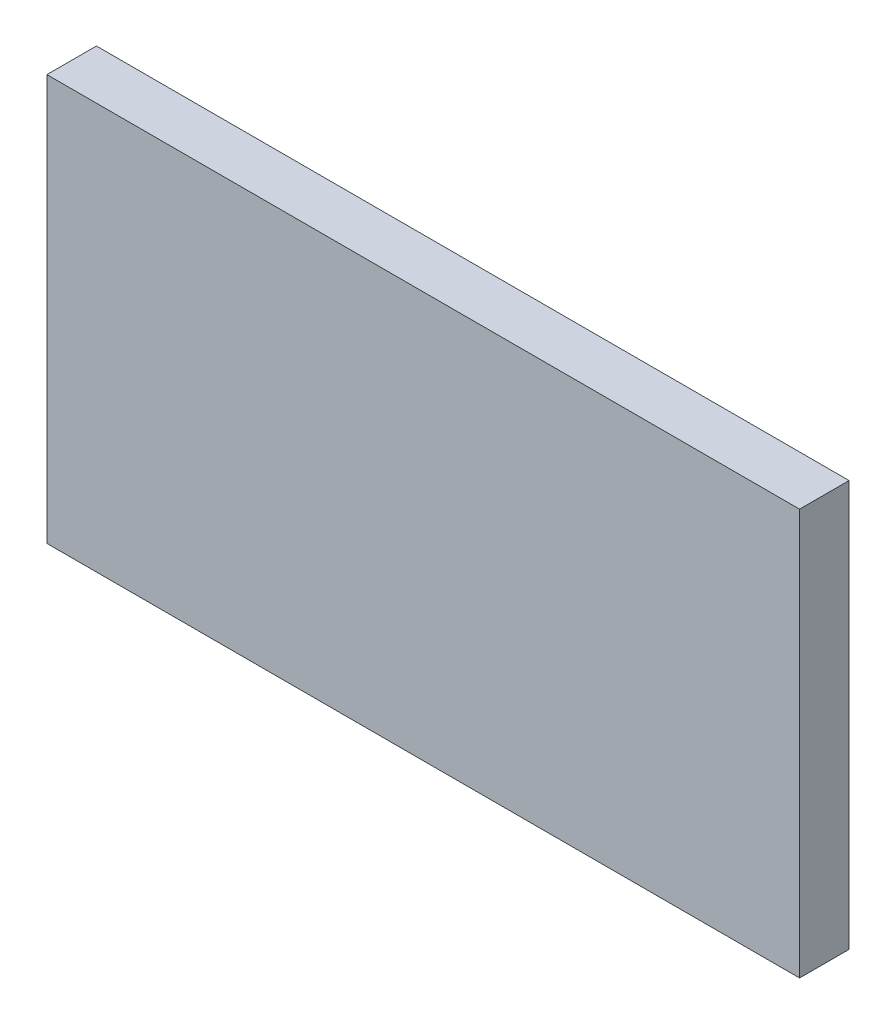
ISO-10303-21;
HEADER;
FILE_DESCRIPTION(('STEP AP214'),'2;1');
FILE_NAME('part.step','',(''),(''),'','','');
FILE_SCHEMA(('AUTOMOTIVE_DESIGN { 1 0 10303 214 1 1 1 1 }'));
ENDSEC;
DATA;
#1=APPLICATION_CONTEXT('core data for automotive mechanical design processes');
#2=APPLICATION_PROTOCOL_DEFINITION('international standard','automotive_design',2000,#1);
#3=PRODUCT_CONTEXT('',#1,'mechanical');
#4=PRODUCT('Part','Part','',(#3));
#5=PRODUCT_RELATED_PRODUCT_CATEGORY('part','',(#4));
#6=PRODUCT_DEFINITION_FORMATION('','',#4);
#7=PRODUCT_DEFINITION_CONTEXT('part definition',#1,'design');
#8=PRODUCT_DEFINITION('design','',#6,#7);
#9=PRODUCT_DEFINITION_SHAPE('','',#8);
#10=(LENGTH_UNIT() NAMED_UNIT(*) SI_UNIT(.MILLI.,.METRE.));
#11=(NAMED_UNIT(*) PLANE_ANGLE_UNIT() SI_UNIT($,.RADIAN.));
#12=(NAMED_UNIT(*) SI_UNIT($,.STERADIAN.) SOLID_ANGLE_UNIT());
#13=UNCERTAINTY_MEASURE_WITH_UNIT(LENGTH_MEASURE(1.E-05),#10,'distance_accuracy_value','');
#14=(GEOMETRIC_REPRESENTATION_CONTEXT(3) GLOBAL_UNCERTAINTY_ASSIGNED_CONTEXT((#13)) GLOBAL_UNIT_ASSIGNED_CONTEXT((#10,
#11,#12)) REPRESENTATION_CONTEXT('',''));
#15=CARTESIAN_POINT('',(0.,0.,0.));
#16=DIRECTION('',(0.,0.,1.));
#17=DIRECTION('',(1.,0.,0.));
#18=AXIS2_PLACEMENT_3D('',#15,#16,#17);
#19=CARTESIAN_POINT('',(152.,-82.,20.));
#20=DIRECTION('',(-1.,0.,0.));
#21=DIRECTION('',(0.,0.,1.));
#22=AXIS2_PLACEMENT_3D('',#19,#20,#21);
#23=PLANE('',#22);
#24=DIRECTION('',(0.,1.,0.));
#25=VECTOR('',#24,1.);
#26=CARTESIAN_POINT('',(152.,-82.,0.));
#27=LINE('',#26,#25);
#28=CARTESIAN_POINT('',(152.,-82.,0.));
#29=VERTEX_POINT('',#28);
#30=CARTESIAN_POINT('',(152.,82.,0.));
#31=VERTEX_POINT('',#30);
#32=EDGE_CURVE('E112',#29,#31,#27,.T.);
#33=ORIENTED_EDGE('',*,*,#32,.T.);
#34=DIRECTION('',(0.,0.,-1.));
#35=VECTOR('',#34,1.);
#36=CARTESIAN_POINT('',(152.,82.,20.));
#37=LINE('',#36,#35);
#38=CARTESIAN_POINT('',(152.,82.,20.));
#39=VERTEX_POINT('',#38);
#40=EDGE_CURVE('E11',#39,#31,#37,.T.);
#41=ORIENTED_EDGE('',*,*,#40,.F.);
#42=DIRECTION('',(0.,1.,0.));
#43=VECTOR('',#42,1.);
#44=CARTESIAN_POINT('',(152.,-82.,20.));
#45=LINE('',#44,#43);
#46=CARTESIAN_POINT('',(152.,-82.,20.));
#47=VERTEX_POINT('',#46);
#48=EDGE_CURVE('E95',#47,#39,#45,.T.);
#49=ORIENTED_EDGE('',*,*,#48,.F.);
#50=DIRECTION('',(0.,0.,-1.));
#51=VECTOR('',#50,1.);
#52=CARTESIAN_POINT('',(152.,-82.,20.));
#53=LINE('',#52,#51);
#54=EDGE_CURVE('E108',#47,#29,#53,.T.);
#55=ORIENTED_EDGE('',*,*,#54,.T.);
#56=EDGE_LOOP('',(#33,#41,#49,#55));
#57=FACE_BOUND('',#56,.T.);
#58=ADVANCED_FACE('F43',(#57),#23,.F.);
#59=CARTESIAN_POINT('',(-152.,82.,20.));
#60=DIRECTION('',(0.,-1.,0.));
#61=DIRECTION('',(0.,0.,-1.));
#62=AXIS2_PLACEMENT_3D('',#59,#60,#61);
#63=PLANE('',#62);
#64=DIRECTION('',(-1.,0.,0.));
#65=VECTOR('',#64,1.);
#66=CARTESIAN_POINT('',(-152.,82.,0.));
#67=LINE('',#66,#65);
#68=CARTESIAN_POINT('',(-152.,82.,0.));
#69=VERTEX_POINT('',#68);
#70=EDGE_CURVE('E100',#31,#69,#67,.T.);
#71=ORIENTED_EDGE('',*,*,#70,.T.);
#72=DIRECTION('',(0.,0.,-1.));
#73=VECTOR('',#72,1.);
#74=CARTESIAN_POINT('',(-152.,82.,20.));
#75=LINE('',#74,#73);
#76=CARTESIAN_POINT('',(-152.,82.,20.));
#77=VERTEX_POINT('',#76);
#78=EDGE_CURVE('E52',#77,#69,#75,.T.);
#79=ORIENTED_EDGE('',*,*,#78,.F.);
#80=DIRECTION('',(-1.,0.,0.));
#81=VECTOR('',#80,1.);
#82=CARTESIAN_POINT('',(-152.,82.,20.));
#83=LINE('',#82,#81);
#84=EDGE_CURVE('E90',#39,#77,#83,.T.);
#85=ORIENTED_EDGE('',*,*,#84,.F.);
#86=ORIENTED_EDGE('',*,*,#40,.T.);
#87=EDGE_LOOP('',(#71,#79,#85,#86));
#88=FACE_BOUND('',#87,.T.);
#89=ADVANCED_FACE('F99',(#88),#63,.F.);
#90=CARTESIAN_POINT('',(-152.,-82.,20.));
#91=DIRECTION('',(1.,0.,0.));
#92=DIRECTION('',(0.,0.,-1.));
#93=AXIS2_PLACEMENT_3D('',#90,#91,#92);
#94=PLANE('',#93);
#95=DIRECTION('',(0.,-1.,0.));
#96=VECTOR('',#95,1.);
#97=CARTESIAN_POINT('',(-152.,-82.,0.));
#98=LINE('',#97,#96);
#99=CARTESIAN_POINT('',(-152.,-82.,0.));
#100=VERTEX_POINT('',#99);
#101=EDGE_CURVE('E77',#69,#100,#98,.T.);
#102=ORIENTED_EDGE('',*,*,#101,.T.);
#103=DIRECTION('',(0.,0.,-1.));
#104=VECTOR('',#103,1.);
#105=CARTESIAN_POINT('',(-152.,-82.,20.));
#106=LINE('',#105,#104);
#107=CARTESIAN_POINT('',(-152.,-82.,20.));
#108=VERTEX_POINT('',#107);
#109=EDGE_CURVE('E102',#108,#100,#106,.T.);
#110=ORIENTED_EDGE('',*,*,#109,.F.);
#111=DIRECTION('',(0.,-1.,0.));
#112=VECTOR('',#111,1.);
#113=CARTESIAN_POINT('',(-152.,-82.,20.));
#114=LINE('',#113,#112);
#115=EDGE_CURVE('E93',#77,#108,#114,.T.);
#116=ORIENTED_EDGE('',*,*,#115,.F.);
#117=ORIENTED_EDGE('',*,*,#78,.T.);
#118=EDGE_LOOP('',(#102,#110,#116,#117));
#119=FACE_BOUND('',#118,.T.);
#120=ADVANCED_FACE('F103',(#119),#94,.F.);
#121=CARTESIAN_POINT('',(-152.,-82.,20.));
#122=DIRECTION('',(0.,1.,0.));
#123=DIRECTION('',(0.,0.,1.));
#124=AXIS2_PLACEMENT_3D('',#121,#122,#123);
#125=PLANE('',#124);
#126=DIRECTION('',(1.,0.,0.));
#127=VECTOR('',#126,1.);
#128=CARTESIAN_POINT('',(-152.,-82.,0.));
#129=LINE('',#128,#127);
#130=EDGE_CURVE('E83',#100,#29,#129,.T.);
#131=ORIENTED_EDGE('',*,*,#130,.T.);
#132=ORIENTED_EDGE('',*,*,#54,.F.);
#133=DIRECTION('',(1.,0.,0.));
#134=VECTOR('',#133,1.);
#135=CARTESIAN_POINT('',(-152.,-82.,20.));
#136=LINE('',#135,#134);
#137=EDGE_CURVE('E60',#108,#47,#136,.T.);
#138=ORIENTED_EDGE('',*,*,#137,.F.);
#139=ORIENTED_EDGE('',*,*,#109,.T.);
#140=EDGE_LOOP('',(#131,#132,#138,#139));
#141=FACE_BOUND('',#140,.T.);
#142=ADVANCED_FACE('F126',(#141),#125,.F.);
#143=CARTESIAN_POINT('',(0.,0.,20.));
#144=DIRECTION('',(0.,0.,-1.));
#145=DIRECTION('',(-1.,0.,0.));
#146=AXIS2_PLACEMENT_3D('',#143,#144,#145);
#147=PLANE('',#146);
#148=ORIENTED_EDGE('',*,*,#48,.T.);
#149=ORIENTED_EDGE('',*,*,#84,.T.);
#150=ORIENTED_EDGE('',*,*,#115,.T.);
#151=ORIENTED_EDGE('',*,*,#137,.T.);
#152=EDGE_LOOP('',(#148,#149,#150,#151));
#153=FACE_BOUND('',#152,.T.);
#154=ADVANCED_FACE('F91',(#153),#147,.F.);
#155=CARTESIAN_POINT('',(0.,0.,0.));
#156=DIRECTION('',(0.,0.,-1.));
#157=DIRECTION('',(-1.,0.,0.));
#158=AXIS2_PLACEMENT_3D('',#155,#156,#157);
#159=PLANE('',#158);
#160=ORIENTED_EDGE('',*,*,#32,.F.);
#161=ORIENTED_EDGE('',*,*,#130,.F.);
#162=ORIENTED_EDGE('',*,*,#101,.F.);
#163=ORIENTED_EDGE('',*,*,#70,.F.);
#164=EDGE_LOOP('',(#160,#161,#162,#163));
#165=FACE_BOUND('',#164,.T.);
#166=ADVANCED_FACE('F129',(#165),#159,.T.);
#167=CLOSED_SHELL('',(#58,#89,#120,#142,#154,#166));
#168=MANIFOLD_SOLID_BREP('B2',#167);
#169=ADVANCED_BREP_SHAPE_REPRESENTATION('',(#18,#168),#14);
#170=SHAPE_DEFINITION_REPRESENTATION(#9,#169);
ENDSEC;
END-ISO-10303-21;
